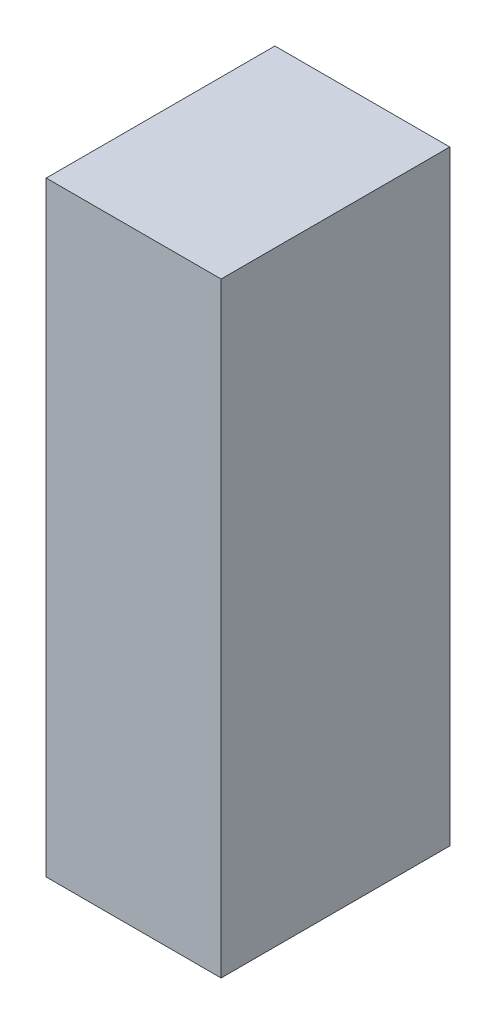
ISO-10303-21;
HEADER;
FILE_DESCRIPTION(('STEP AP214'),'2;1');
FILE_NAME('part.step','',(''),(''),'','','');
FILE_SCHEMA(('AUTOMOTIVE_DESIGN { 1 0 10303 214 1 1 1 1 }'));
ENDSEC;
DATA;
#1=APPLICATION_CONTEXT('core data for automotive mechanical design processes');
#2=APPLICATION_PROTOCOL_DEFINITION('international standard','automotive_design',2000,#1);
#3=PRODUCT_CONTEXT('',#1,'mechanical');
#4=PRODUCT('Part','Part','',(#3));
#5=PRODUCT_RELATED_PRODUCT_CATEGORY('part','',(#4));
#6=PRODUCT_DEFINITION_FORMATION('','',#4);
#7=PRODUCT_DEFINITION_CONTEXT('part definition',#1,'design');
#8=PRODUCT_DEFINITION('design','',#6,#7);
#9=PRODUCT_DEFINITION_SHAPE('','',#8);
#10=(LENGTH_UNIT() NAMED_UNIT(*) SI_UNIT(.MILLI.,.METRE.));
#11=(NAMED_UNIT(*) PLANE_ANGLE_UNIT() SI_UNIT($,.RADIAN.));
#12=(NAMED_UNIT(*) SI_UNIT($,.STERADIAN.) SOLID_ANGLE_UNIT());
#13=UNCERTAINTY_MEASURE_WITH_UNIT(LENGTH_MEASURE(1.E-05),#10,'distance_accuracy_value','');
#14=(GEOMETRIC_REPRESENTATION_CONTEXT(3) GLOBAL_UNCERTAINTY_ASSIGNED_CONTEXT((#13)) GLOBAL_UNIT_ASSIGNED_CONTEXT((#10,
#11,#12)) REPRESENTATION_CONTEXT('',''));
#15=CARTESIAN_POINT('',(0.,0.,0.));
#16=DIRECTION('',(0.,0.,1.));
#17=DIRECTION('',(1.,0.,0.));
#18=AXIS2_PLACEMENT_3D('',#15,#16,#17);
#19=CARTESIAN_POINT('',(-6.5,22.5,17.));
#20=DIRECTION('',(1.,0.,0.));
#21=DIRECTION('',(0.,0.,-1.));
#22=AXIS2_PLACEMENT_3D('',#19,#20,#21);
#23=PLANE('',#22);
#24=DIRECTION('',(0.,-1.,0.));
#25=VECTOR('',#24,1.);
#26=CARTESIAN_POINT('',(-6.5,22.5,0.));
#27=LINE('',#26,#25);
#28=CARTESIAN_POINT('',(-6.5,22.5,0.));
#29=VERTEX_POINT('',#28);
#30=CARTESIAN_POINT('',(-6.5,-22.5,0.));
#31=VERTEX_POINT('',#30);
#32=EDGE_CURVE('E96',#29,#31,#27,.T.);
#33=ORIENTED_EDGE('',*,*,#32,.T.);
#34=DIRECTION('',(0.,0.,-1.));
#35=VECTOR('',#34,1.);
#36=CARTESIAN_POINT('',(-6.5,-22.5,17.));
#37=LINE('',#36,#35);
#38=CARTESIAN_POINT('',(-6.5,-22.5,17.));
#39=VERTEX_POINT('',#38);
#40=EDGE_CURVE('E11',#39,#31,#37,.T.);
#41=ORIENTED_EDGE('',*,*,#40,.F.);
#42=DIRECTION('',(0.,-1.,0.));
#43=VECTOR('',#42,1.);
#44=CARTESIAN_POINT('',(-6.5,22.5,17.));
#45=LINE('',#44,#43);
#46=CARTESIAN_POINT('',(-6.5,22.5,17.));
#47=VERTEX_POINT('',#46);
#48=EDGE_CURVE('E84',#47,#39,#45,.T.);
#49=ORIENTED_EDGE('',*,*,#48,.F.);
#50=DIRECTION('',(0.,0.,-1.));
#51=VECTOR('',#50,1.);
#52=CARTESIAN_POINT('',(-6.5,22.5,17.));
#53=LINE('',#52,#51);
#54=EDGE_CURVE('E92',#47,#29,#53,.T.);
#55=ORIENTED_EDGE('',*,*,#54,.T.);
#56=EDGE_LOOP('',(#33,#41,#49,#55));
#57=FACE_BOUND('',#56,.T.);
#58=ADVANCED_FACE('F33',(#57),#23,.F.);
#59=CARTESIAN_POINT('',(-6.5,-22.5,17.));
#60=DIRECTION('',(0.,1.,0.));
#61=DIRECTION('',(0.,0.,1.));
#62=AXIS2_PLACEMENT_3D('',#59,#60,#61);
#63=PLANE('',#62);
#64=DIRECTION('',(1.,0.,0.));
#65=VECTOR('',#64,1.);
#66=CARTESIAN_POINT('',(-6.5,-22.5,0.));
#67=LINE('',#66,#65);
#68=CARTESIAN_POINT('',(6.5,-22.5,0.));
#69=VERTEX_POINT('',#68);
#70=EDGE_CURVE('E88',#31,#69,#67,.T.);
#71=ORIENTED_EDGE('',*,*,#70,.T.);
#72=DIRECTION('',(0.,0.,-1.));
#73=VECTOR('',#72,1.);
#74=CARTESIAN_POINT('',(6.5,-22.5,17.));
#75=LINE('',#74,#73);
#76=CARTESIAN_POINT('',(6.5,-22.5,17.));
#77=VERTEX_POINT('',#76);
#78=EDGE_CURVE('E41',#77,#69,#75,.T.);
#79=ORIENTED_EDGE('',*,*,#78,.F.);
#80=DIRECTION('',(1.,0.,0.));
#81=VECTOR('',#80,1.);
#82=CARTESIAN_POINT('',(-6.5,-22.5,17.));
#83=LINE('',#82,#81);
#84=EDGE_CURVE('E79',#39,#77,#83,.T.);
#85=ORIENTED_EDGE('',*,*,#84,.F.);
#86=ORIENTED_EDGE('',*,*,#40,.T.);
#87=EDGE_LOOP('',(#71,#79,#85,#86));
#88=FACE_BOUND('',#87,.T.);
#89=ADVANCED_FACE('F87',(#88),#63,.F.);
#90=CARTESIAN_POINT('',(6.5,-22.5,17.));
#91=DIRECTION('',(-1.,0.,0.));
#92=DIRECTION('',(0.,0.,1.));
#93=AXIS2_PLACEMENT_3D('',#90,#91,#92);
#94=PLANE('',#93);
#95=DIRECTION('',(0.,1.,0.));
#96=VECTOR('',#95,1.);
#97=CARTESIAN_POINT('',(6.5,-22.5,0.));
#98=LINE('',#97,#96);
#99=CARTESIAN_POINT('',(6.5,22.5,0.));
#100=VERTEX_POINT('',#99);
#101=EDGE_CURVE('E66',#69,#100,#98,.T.);
#102=ORIENTED_EDGE('',*,*,#101,.T.);
#103=DIRECTION('',(0.,0.,-1.));
#104=VECTOR('',#103,1.);
#105=CARTESIAN_POINT('',(6.5,22.5,17.));
#106=LINE('',#105,#104);
#107=CARTESIAN_POINT('',(6.5,22.5,17.));
#108=VERTEX_POINT('',#107);
#109=EDGE_CURVE('E89',#108,#100,#106,.T.);
#110=ORIENTED_EDGE('',*,*,#109,.F.);
#111=DIRECTION('',(0.,1.,0.));
#112=VECTOR('',#111,1.);
#113=CARTESIAN_POINT('',(6.5,-22.5,17.));
#114=LINE('',#113,#112);
#115=EDGE_CURVE('E82',#77,#108,#114,.T.);
#116=ORIENTED_EDGE('',*,*,#115,.F.);
#117=ORIENTED_EDGE('',*,*,#78,.T.);
#118=EDGE_LOOP('',(#102,#110,#116,#117));
#119=FACE_BOUND('',#118,.T.);
#120=ADVANCED_FACE('F90',(#119),#94,.F.);
#121=CARTESIAN_POINT('',(6.5,22.5,17.));
#122=DIRECTION('',(0.,-1.,0.));
#123=DIRECTION('',(0.,0.,-1.));
#124=AXIS2_PLACEMENT_3D('',#121,#122,#123);
#125=PLANE('',#124);
#126=DIRECTION('',(-1.,0.,0.));
#127=VECTOR('',#126,1.);
#128=CARTESIAN_POINT('',(6.5,22.5,0.));
#129=LINE('',#128,#127);
#130=EDGE_CURVE('E72',#100,#29,#129,.T.);
#131=ORIENTED_EDGE('',*,*,#130,.T.);
#132=ORIENTED_EDGE('',*,*,#54,.F.);
#133=DIRECTION('',(-1.,0.,0.));
#134=VECTOR('',#133,1.);
#135=CARTESIAN_POINT('',(6.5,22.5,17.));
#136=LINE('',#135,#134);
#137=EDGE_CURVE('E49',#108,#47,#136,.T.);
#138=ORIENTED_EDGE('',*,*,#137,.F.);
#139=ORIENTED_EDGE('',*,*,#109,.T.);
#140=EDGE_LOOP('',(#131,#132,#138,#139));
#141=FACE_BOUND('',#140,.T.);
#142=ADVANCED_FACE('F103',(#141),#125,.F.);
#143=CARTESIAN_POINT('',(0.,0.,17.));
#144=DIRECTION('',(0.,0.,1.));
#145=DIRECTION('',(1.,0.,0.));
#146=AXIS2_PLACEMENT_3D('',#143,#144,#145);
#147=PLANE('',#146);
#148=ORIENTED_EDGE('',*,*,#48,.T.);
#149=ORIENTED_EDGE('',*,*,#84,.T.);
#150=ORIENTED_EDGE('',*,*,#115,.T.);
#151=ORIENTED_EDGE('',*,*,#137,.T.);
#152=EDGE_LOOP('',(#148,#149,#150,#151));
#153=FACE_BOUND('',#152,.T.);
#154=ADVANCED_FACE('F80',(#153),#147,.T.);
#155=CARTESIAN_POINT('',(0.,0.,0.));
#156=DIRECTION('',(0.,0.,1.));
#157=DIRECTION('',(1.,0.,0.));
#158=AXIS2_PLACEMENT_3D('',#155,#156,#157);
#159=PLANE('',#158);
#160=ORIENTED_EDGE('',*,*,#32,.F.);
#161=ORIENTED_EDGE('',*,*,#130,.F.);
#162=ORIENTED_EDGE('',*,*,#101,.F.);
#163=ORIENTED_EDGE('',*,*,#70,.F.);
#164=EDGE_LOOP('',(#160,#161,#162,#163));
#165=FACE_BOUND('',#164,.T.);
#166=ADVANCED_FACE('F106',(#165),#159,.F.);
#167=CLOSED_SHELL('',(#58,#89,#120,#142,#154,#166));
#168=MANIFOLD_SOLID_BREP('B2',#167);
#169=ADVANCED_BREP_SHAPE_REPRESENTATION('',(#18,#168),#14);
#170=SHAPE_DEFINITION_REPRESENTATION(#9,#169);
ENDSEC;
END-ISO-10303-21;
